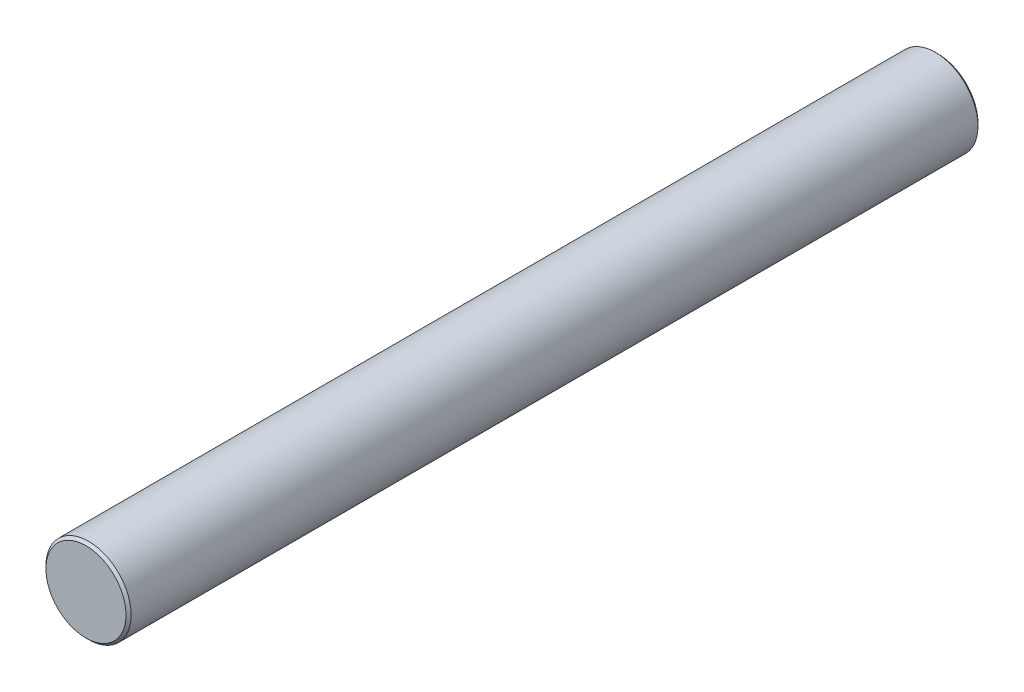
ISO-10303-21;
HEADER;
FILE_DESCRIPTION(('STEP AP214'),'2;1');
FILE_NAME('part.step','',(''),(''),'','','');
FILE_SCHEMA(('AUTOMOTIVE_DESIGN { 1 0 10303 214 1 1 1 1 }'));
ENDSEC;
DATA;
#1=APPLICATION_CONTEXT('core data for automotive mechanical design processes');
#2=APPLICATION_PROTOCOL_DEFINITION('international standard','automotive_design',2000,#1);
#3=PRODUCT_CONTEXT('',#1,'mechanical');
#4=PRODUCT('Part','Part','',(#3));
#5=PRODUCT_RELATED_PRODUCT_CATEGORY('part','',(#4));
#6=PRODUCT_DEFINITION_FORMATION('','',#4);
#7=PRODUCT_DEFINITION_CONTEXT('part definition',#1,'design');
#8=PRODUCT_DEFINITION('design','',#6,#7);
#9=PRODUCT_DEFINITION_SHAPE('','',#8);
#10=(LENGTH_UNIT() NAMED_UNIT(*) SI_UNIT(.MILLI.,.METRE.));
#11=(NAMED_UNIT(*) PLANE_ANGLE_UNIT() SI_UNIT($,.RADIAN.));
#12=(NAMED_UNIT(*) SI_UNIT($,.STERADIAN.) SOLID_ANGLE_UNIT());
#13=UNCERTAINTY_MEASURE_WITH_UNIT(LENGTH_MEASURE(1.E-05),#10,'distance_accuracy_value','');
#14=(GEOMETRIC_REPRESENTATION_CONTEXT(3) GLOBAL_UNCERTAINTY_ASSIGNED_CONTEXT((#13)) GLOBAL_UNIT_ASSIGNED_CONTEXT((#10,
#11,#12)) REPRESENTATION_CONTEXT('',''));
#15=CARTESIAN_POINT('',(0.,0.,0.));
#16=DIRECTION('',(0.,0.,1.));
#17=DIRECTION('',(1.,0.,0.));
#18=AXIS2_PLACEMENT_3D('',#15,#16,#17);
#19=CARTESIAN_POINT('',(0.,0.,50.));
#20=DIRECTION('',(0.,0.,-1.));
#21=DIRECTION('',(-1.,0.,0.));
#22=AXIS2_PLACEMENT_3D('',#19,#20,#21);
#23=CYLINDRICAL_SURFACE('',#22,5.);
#24=CARTESIAN_POINT('',(0.,0.,-49.7));
#25=DIRECTION('',(0.,0.,1.));
#26=DIRECTION('',(1.,0.,0.));
#27=AXIS2_PLACEMENT_3D('',#24,#25,#26);
#28=CIRCLE('',#27,5.);
#29=CARTESIAN_POINT('',(5.,0.,-49.7));
#30=VERTEX_POINT('',#29);
#31=EDGE_CURVE('E49',#30,#30,#28,.T.);
#32=ORIENTED_EDGE('',*,*,#31,.T.);
#33=EDGE_LOOP('',(#32));
#34=FACE_BOUND('',#33,.T.);
#35=CARTESIAN_POINT('',(0.,0.,49.7));
#36=DIRECTION('',(0.,0.,1.));
#37=DIRECTION('',(1.,0.,0.));
#38=AXIS2_PLACEMENT_3D('',#35,#36,#37);
#39=CIRCLE('',#38,5.);
#40=CARTESIAN_POINT('',(5.,0.,49.7));
#41=VERTEX_POINT('',#40);
#42=EDGE_CURVE('E53',#41,#41,#39,.F.);
#43=ORIENTED_EDGE('',*,*,#42,.T.);
#44=EDGE_LOOP('',(#43));
#45=FACE_BOUND('',#44,.T.);
#46=ADVANCED_FACE('F37',(#34,#45),#23,.T.);
#47=CARTESIAN_POINT('',(0.,0.,50.));
#48=DIRECTION('',(0.,0.,1.));
#49=DIRECTION('',(1.,0.,0.));
#50=AXIS2_PLACEMENT_3D('',#47,#48,#49);
#51=PLANE('',#50);
#52=CARTESIAN_POINT('',(0.,0.,50.));
#53=DIRECTION('',(0.,0.,1.));
#54=DIRECTION('',(1.,0.,0.));
#55=AXIS2_PLACEMENT_3D('',#52,#53,#54);
#56=CIRCLE('',#55,4.7);
#57=CARTESIAN_POINT('',(4.7,0.,50.));
#58=VERTEX_POINT('',#57);
#59=EDGE_CURVE('E10',#58,#58,#56,.T.);
#60=ORIENTED_EDGE('',*,*,#59,.T.);
#61=EDGE_LOOP('',(#60));
#62=FACE_BOUND('',#61,.T.);
#63=ADVANCED_FACE('F69',(#62),#51,.T.);
#64=CARTESIAN_POINT('',(0.,0.,-50.));
#65=DIRECTION('',(0.,0.,1.));
#66=DIRECTION('',(1.,0.,0.));
#67=AXIS2_PLACEMENT_3D('',#64,#65,#66);
#68=PLANE('',#67);
#69=CARTESIAN_POINT('',(0.,0.,-50.));
#70=DIRECTION('',(0.,0.,1.));
#71=DIRECTION('',(1.,0.,0.));
#72=AXIS2_PLACEMENT_3D('',#69,#70,#71);
#73=CIRCLE('',#72,4.69999999999998);
#74=CARTESIAN_POINT('',(4.69999999999998,0.,-50.));
#75=VERTEX_POINT('',#74);
#76=EDGE_CURVE('E45',#75,#75,#73,.F.);
#77=ORIENTED_EDGE('',*,*,#76,.T.);
#78=EDGE_LOOP('',(#77));
#79=FACE_BOUND('',#78,.T.);
#80=ADVANCED_FACE('F66',(#79),#68,.F.);
#81=CARTESIAN_POINT('',(0.,0.,-49.7));
#82=DIRECTION('',(0.,0.,1.));
#83=DIRECTION('',(1.,0.,0.));
#84=AXIS2_PLACEMENT_3D('',#81,#82,#83);
#85=CONICAL_SURFACE('',#84,5.,0.78539816339746);
#86=ORIENTED_EDGE('',*,*,#76,.F.);
#87=EDGE_LOOP('',(#86));
#88=FACE_BOUND('',#87,.T.);
#89=ORIENTED_EDGE('',*,*,#31,.F.);
#90=EDGE_LOOP('',(#89));
#91=FACE_BOUND('',#90,.T.);
#92=ADVANCED_FACE('F62',(#88,#91),#85,.T.);
#93=CARTESIAN_POINT('',(0.,0.,50.));
#94=DIRECTION('',(0.,0.,-1.));
#95=DIRECTION('',(-1.,0.,0.));
#96=AXIS2_PLACEMENT_3D('',#93,#94,#95);
#97=CONICAL_SURFACE('',#96,4.7,0.785398163397448);
#98=ORIENTED_EDGE('',*,*,#42,.F.);
#99=EDGE_LOOP('',(#98));
#100=FACE_BOUND('',#99,.T.);
#101=ORIENTED_EDGE('',*,*,#59,.F.);
#102=EDGE_LOOP('',(#101));
#103=FACE_BOUND('',#102,.T.);
#104=ADVANCED_FACE('F40',(#100,#103),#97,.T.);
#105=CLOSED_SHELL('',(#46,#63,#80,#92,#104));
#106=MANIFOLD_SOLID_BREP('B2',#105);
#107=ADVANCED_BREP_SHAPE_REPRESENTATION('',(#18,#106),#14);
#108=SHAPE_DEFINITION_REPRESENTATION(#9,#107);
ENDSEC;
END-ISO-10303-21;
